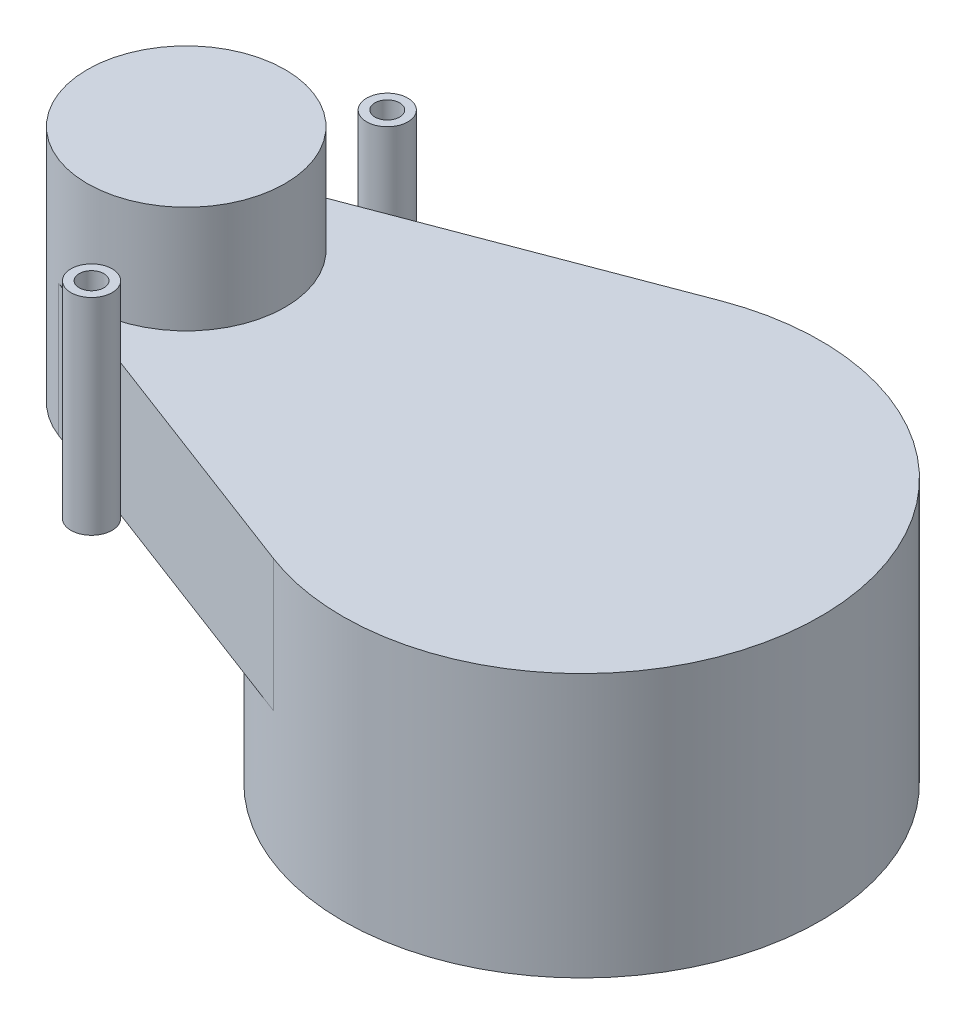
ISO-10303-21;
HEADER;
FILE_DESCRIPTION(('STEP AP214'),'2;1');
FILE_NAME('part.step','',(''),(''),'','','');
FILE_SCHEMA(('AUTOMOTIVE_DESIGN { 1 0 10303 214 1 1 1 1 }'));
ENDSEC;
DATA;
#1=APPLICATION_CONTEXT('core data for automotive mechanical design processes');
#2=APPLICATION_PROTOCOL_DEFINITION('international standard','automotive_design',2000,#1);
#3=PRODUCT_CONTEXT('',#1,'mechanical');
#4=PRODUCT('Part','Part','',(#3));
#5=PRODUCT_RELATED_PRODUCT_CATEGORY('part','',(#4));
#6=PRODUCT_DEFINITION_FORMATION('','',#4);
#7=PRODUCT_DEFINITION_CONTEXT('part definition',#1,'design');
#8=PRODUCT_DEFINITION('design','',#6,#7);
#9=PRODUCT_DEFINITION_SHAPE('','',#8);
#10=(LENGTH_UNIT() NAMED_UNIT(*) SI_UNIT(.MILLI.,.METRE.));
#11=(NAMED_UNIT(*) PLANE_ANGLE_UNIT() SI_UNIT($,.RADIAN.));
#12=(NAMED_UNIT(*) SI_UNIT($,.STERADIAN.) SOLID_ANGLE_UNIT());
#13=UNCERTAINTY_MEASURE_WITH_UNIT(LENGTH_MEASURE(1.E-05),#10,'distance_accuracy_value','');
#14=(GEOMETRIC_REPRESENTATION_CONTEXT(3) GLOBAL_UNCERTAINTY_ASSIGNED_CONTEXT((#13)) GLOBAL_UNIT_ASSIGNED_CONTEXT((#10,
#11,#12)) REPRESENTATION_CONTEXT('',''));
#15=CARTESIAN_POINT('',(0.,0.,0.));
#16=DIRECTION('',(0.,0.,1.));
#17=DIRECTION('',(1.,0.,0.));
#18=AXIS2_PLACEMENT_3D('',#15,#16,#17);
#19=CARTESIAN_POINT('',(-41.5439360482389,25.,-17.95));
#20=DIRECTION('',(0.,1.,0.));
#21=DIRECTION('',(0.,0.,1.));
#22=AXIS2_PLACEMENT_3D('',#19,#20,#21);
#23=PLANE('',#22);
#24=CARTESIAN_POINT('',(-41.5439360482389,25.,-17.95));
#25=DIRECTION('',(0.,1.,0.));
#26=DIRECTION('',(0.,0.,1.));
#27=AXIS2_PLACEMENT_3D('',#24,#25,#26);
#28=CIRCLE('',#27,2.5);
#29=CARTESIAN_POINT('',(-41.5439360482389,25.,-15.45));
#30=VERTEX_POINT('',#29);
#31=EDGE_CURVE('E71',#30,#30,#28,.T.);
#32=ORIENTED_EDGE('',*,*,#31,.T.);
#33=EDGE_LOOP('',(#32));
#34=FACE_BOUND('',#33,.T.);
#35=CARTESIAN_POINT('',(-41.5439360482389,25.,-17.95));
#36=DIRECTION('',(0.,1.,0.));
#37=DIRECTION('',(0.,0.,1.));
#38=AXIS2_PLACEMENT_3D('',#35,#36,#37);
#39=CIRCLE('',#38,1.5);
#40=CARTESIAN_POINT('',(-41.5439360482389,25.,-16.45));
#41=VERTEX_POINT('',#40);
#42=EDGE_CURVE('E62',#41,#41,#39,.T.);
#43=ORIENTED_EDGE('',*,*,#42,.F.);
#44=EDGE_LOOP('',(#43));
#45=FACE_BOUND('',#44,.T.);
#46=ADVANCED_FACE('F58',(#34,#45),#23,.T.);
#47=CARTESIAN_POINT('',(-41.5439360482389,0.,-17.95));
#48=DIRECTION('',(0.,1.,0.));
#49=DIRECTION('',(0.,0.,1.));
#50=AXIS2_PLACEMENT_3D('',#47,#48,#49);
#51=PLANE('',#50);
#52=CARTESIAN_POINT('',(-41.5439360482389,0.,-17.95));
#53=DIRECTION('',(0.,1.,0.));
#54=DIRECTION('',(0.,0.,1.));
#55=AXIS2_PLACEMENT_3D('',#52,#53,#54);
#56=CIRCLE('',#55,2.5);
#57=CARTESIAN_POINT('',(-41.5439360482389,0.,-15.45));
#58=VERTEX_POINT('',#57);
#59=EDGE_CURVE('E69',#58,#58,#56,.T.);
#60=ORIENTED_EDGE('',*,*,#59,.F.);
#61=EDGE_LOOP('',(#60));
#62=FACE_BOUND('',#61,.T.);
#63=CARTESIAN_POINT('',(-41.5439360482389,0.,-17.95));
#64=DIRECTION('',(0.,1.,0.));
#65=DIRECTION('',(0.,0.,1.));
#66=AXIS2_PLACEMENT_3D('',#63,#64,#65);
#67=CIRCLE('',#66,1.5);
#68=CARTESIAN_POINT('',(-41.5439360482389,0.,-16.45));
#69=VERTEX_POINT('',#68);
#70=EDGE_CURVE('E11',#69,#69,#67,.T.);
#71=ORIENTED_EDGE('',*,*,#70,.T.);
#72=EDGE_LOOP('',(#71));
#73=FACE_BOUND('',#72,.T.);
#74=ADVANCED_FACE('F79',(#62,#73),#51,.F.);
#75=CARTESIAN_POINT('',(-41.5439360482389,25.,-17.95));
#76=DIRECTION('',(0.,-1.,0.));
#77=DIRECTION('',(0.,0.,-1.));
#78=AXIS2_PLACEMENT_3D('',#75,#76,#77);
#79=CYLINDRICAL_SURFACE('',#78,2.5);
#80=ORIENTED_EDGE('',*,*,#31,.F.);
#81=EDGE_LOOP('',(#80));
#82=FACE_BOUND('',#81,.T.);
#83=ORIENTED_EDGE('',*,*,#59,.T.);
#84=EDGE_LOOP('',(#83));
#85=FACE_BOUND('',#84,.T.);
#86=ADVANCED_FACE('F77',(#82,#85),#79,.T.);
#87=CARTESIAN_POINT('',(-41.5439360482389,25.,-17.95));
#88=DIRECTION('',(0.,-1.,0.));
#89=DIRECTION('',(0.,0.,-1.));
#90=AXIS2_PLACEMENT_3D('',#87,#88,#89);
#91=CYLINDRICAL_SURFACE('',#90,1.5);
#92=ORIENTED_EDGE('',*,*,#42,.T.);
#93=EDGE_LOOP('',(#92));
#94=FACE_BOUND('',#93,.T.);
#95=ORIENTED_EDGE('',*,*,#70,.F.);
#96=EDGE_LOOP('',(#95));
#97=FACE_BOUND('',#96,.T.);
#98=ADVANCED_FACE('F60',(#94,#97),#91,.F.);
#99=CLOSED_SHELL('',(#46,#74,#86,#98));
#100=MANIFOLD_SOLID_BREP('B2',#99);
#101=CARTESIAN_POINT('',(-41.5439360482389,25.,17.95));
#102=DIRECTION('',(0.,1.,0.));
#103=DIRECTION('',(0.,0.,1.));
#104=AXIS2_PLACEMENT_3D('',#101,#102,#103);
#105=PLANE('',#104);
#106=CARTESIAN_POINT('',(-41.5439360482389,25.,17.95));
#107=DIRECTION('',(0.,1.,0.));
#108=DIRECTION('',(0.,0.,1.));
#109=AXIS2_PLACEMENT_3D('',#106,#107,#108);
#110=CIRCLE('',#109,2.5);
#111=CARTESIAN_POINT('',(-41.5439360482389,25.,20.45));
#112=VERTEX_POINT('',#111);
#113=EDGE_CURVE('E57',#112,#112,#110,.T.);
#114=ORIENTED_EDGE('',*,*,#113,.T.);
#115=EDGE_LOOP('',(#114));
#116=FACE_BOUND('',#115,.T.);
#117=CARTESIAN_POINT('',(-41.5439360482389,25.,17.95));
#118=DIRECTION('',(0.,1.,0.));
#119=DIRECTION('',(0.,0.,1.));
#120=AXIS2_PLACEMENT_3D('',#117,#118,#119);
#121=CIRCLE('',#120,1.5);
#122=CARTESIAN_POINT('',(-41.5439360482389,25.,19.45));
#123=VERTEX_POINT('',#122);
#124=EDGE_CURVE('E156',#123,#123,#121,.T.);
#125=ORIENTED_EDGE('',*,*,#124,.F.);
#126=EDGE_LOOP('',(#125));
#127=FACE_BOUND('',#126,.T.);
#128=ADVANCED_FACE('F145',(#116,#127),#105,.T.);
#129=CARTESIAN_POINT('',(-41.5439360482389,0.,17.95));
#130=DIRECTION('',(0.,1.,0.));
#131=DIRECTION('',(0.,0.,1.));
#132=AXIS2_PLACEMENT_3D('',#129,#130,#131);
#133=PLANE('',#132);
#134=CARTESIAN_POINT('',(-41.5439360482389,0.,17.95));
#135=DIRECTION('',(0.,1.,0.));
#136=DIRECTION('',(0.,0.,1.));
#137=AXIS2_PLACEMENT_3D('',#134,#135,#136);
#138=CIRCLE('',#137,2.5);
#139=CARTESIAN_POINT('',(-41.5439360482389,0.,20.45));
#140=VERTEX_POINT('',#139);
#141=EDGE_CURVE('E149',#140,#140,#138,.T.);
#142=ORIENTED_EDGE('',*,*,#141,.F.);
#143=EDGE_LOOP('',(#142));
#144=FACE_BOUND('',#143,.T.);
#145=CARTESIAN_POINT('',(-41.5439360482389,0.,17.95));
#146=DIRECTION('',(0.,1.,0.));
#147=DIRECTION('',(0.,0.,1.));
#148=AXIS2_PLACEMENT_3D('',#145,#146,#147);
#149=CIRCLE('',#148,1.5);
#150=CARTESIAN_POINT('',(-41.5439360482389,0.,19.45));
#151=VERTEX_POINT('',#150);
#152=EDGE_CURVE('E158',#151,#151,#149,.T.);
#153=ORIENTED_EDGE('',*,*,#152,.T.);
#154=EDGE_LOOP('',(#153));
#155=FACE_BOUND('',#154,.T.);
#156=ADVANCED_FACE('F168',(#144,#155),#133,.F.);
#157=CARTESIAN_POINT('',(-41.5439360482389,25.,17.95));
#158=DIRECTION('',(0.,-1.,0.));
#159=DIRECTION('',(0.,0.,-1.));
#160=AXIS2_PLACEMENT_3D('',#157,#158,#159);
#161=CYLINDRICAL_SURFACE('',#160,2.5);
#162=ORIENTED_EDGE('',*,*,#113,.F.);
#163=EDGE_LOOP('',(#162));
#164=FACE_BOUND('',#163,.T.);
#165=ORIENTED_EDGE('',*,*,#141,.T.);
#166=EDGE_LOOP('',(#165));
#167=FACE_BOUND('',#166,.T.);
#168=ADVANCED_FACE('F147',(#164,#167),#161,.T.);
#169=CARTESIAN_POINT('',(-41.5439360482389,25.,17.95));
#170=DIRECTION('',(0.,-1.,0.));
#171=DIRECTION('',(0.,0.,-1.));
#172=AXIS2_PLACEMENT_3D('',#169,#170,#171);
#173=CYLINDRICAL_SURFACE('',#172,1.5);
#174=ORIENTED_EDGE('',*,*,#124,.T.);
#175=EDGE_LOOP('',(#174));
#176=FACE_BOUND('',#175,.T.);
#177=ORIENTED_EDGE('',*,*,#152,.F.);
#178=EDGE_LOOP('',(#177));
#179=FACE_BOUND('',#178,.T.);
#180=ADVANCED_FACE('F164',(#176,#179),#173,.F.);
#181=CLOSED_SHELL('',(#128,#156,#168,#180));
#182=MANIFOLD_SOLID_BREP('B6',#181);
#183=CARTESIAN_POINT('',(0.,-16.,0.));
#184=DIRECTION('',(0.,1.,0.));
#185=DIRECTION('',(0.,0.,1.));
#186=AXIS2_PLACEMENT_3D('',#183,#184,#185);
#187=CYLINDRICAL_SURFACE('',#186,29.);
#188=CARTESIAN_POINT('',(0.,-16.,0.));
#189=DIRECTION('',(0.,1.,0.));
#190=DIRECTION('',(0.,0.,1.));
#191=AXIS2_PLACEMENT_3D('',#188,#189,#190);
#192=CIRCLE('',#191,29.);
#193=CARTESIAN_POINT('',(0.,-16.,29.));
#194=VERTEX_POINT('',#193);
#195=EDGE_CURVE('E231',#194,#194,#192,.T.);
#196=ORIENTED_EDGE('',*,*,#195,.T.);
#197=EDGE_LOOP('',(#196));
#198=FACE_BOUND('',#197,.T.);
#199=CARTESIAN_POINT('',(0.,0.,0.));
#200=DIRECTION('',(0.,1.,0.));
#201=DIRECTION('',(0.,0.,1.));
#202=AXIS2_PLACEMENT_3D('',#199,#200,#201);
#203=CIRCLE('',#202,29.);
#204=CARTESIAN_POINT('',(-10.2708333333333,0.,-27.1202872890183));
#205=VERTEX_POINT('',#204);
#206=CARTESIAN_POINT('',(-10.2708333333333,0.,27.1202872890183));
#207=VERTEX_POINT('',#206);
#208=EDGE_CURVE('E226',#205,#207,#203,.T.);
#209=ORIENTED_EDGE('',*,*,#208,.F.);
#210=DIRECTION('',(0.,-1.,0.));
#211=VECTOR('',#210,1.);
#212=CARTESIAN_POINT('',(-10.2708333333333,16.,-27.1202872890183));
#213=LINE('',#212,#211);
#214=CARTESIAN_POINT('',(-10.2708333333333,16.,-27.1202872890183));
#215=VERTEX_POINT('',#214);
#216=EDGE_CURVE('E276',#215,#205,#213,.T.);
#217=ORIENTED_EDGE('',*,*,#216,.F.);
#218=CARTESIAN_POINT('',(0.,16.,0.));
#219=DIRECTION('',(0.,1.,0.));
#220=DIRECTION('',(0.,0.,1.));
#221=AXIS2_PLACEMENT_3D('',#218,#219,#220);
#222=CIRCLE('',#221,29.);
#223=CARTESIAN_POINT('',(-10.2708333333333,16.,27.1202872890183));
#224=VERTEX_POINT('',#223);
#225=EDGE_CURVE('E281',#224,#215,#222,.T.);
#226=ORIENTED_EDGE('',*,*,#225,.F.);
#227=DIRECTION('',(0.,-1.,0.));
#228=VECTOR('',#227,1.);
#229=CARTESIAN_POINT('',(-10.2708333333333,16.,27.1202872890183));
#230=LINE('',#229,#228);
#231=EDGE_CURVE('E287',#224,#207,#230,.T.);
#232=ORIENTED_EDGE('',*,*,#231,.T.);
#233=EDGE_LOOP('',(#209,#217,#226,#232));
#234=FACE_BOUND('',#233,.T.);
#235=ADVANCED_FACE('F223',(#198,#234),#187,.T.);
#236=CARTESIAN_POINT('',(0.,-16.,0.));
#237=DIRECTION('',(0.,1.,0.));
#238=DIRECTION('',(0.,0.,1.));
#239=AXIS2_PLACEMENT_3D('',#236,#237,#238);
#240=PLANE('',#239);
#241=ORIENTED_EDGE('',*,*,#195,.F.);
#242=EDGE_LOOP('',(#241));
#243=FACE_BOUND('',#242,.T.);
#244=ADVANCED_FACE('F305',(#243),#240,.F.);
#245=CARTESIAN_POINT('',(0.,0.,0.));
#246=DIRECTION('',(0.,1.,0.));
#247=DIRECTION('',(0.,0.,1.));
#248=AXIS2_PLACEMENT_3D('',#245,#246,#247);
#249=PLANE('',#248);
#250=DIRECTION('',(-0.935182320310977,0.,0.354166666666667));
#251=VECTOR('',#250,1.);
#252=CARTESIAN_POINT('',(-10.2708333333333,0.,-27.1202872890183));
#253=LINE('',#252,#251);
#254=CARTESIAN_POINT('',(-52.25,0.,-11.2221878437317));
#255=VERTEX_POINT('',#254);
#256=EDGE_CURVE('E275',#205,#255,#253,.T.);
#257=ORIENTED_EDGE('',*,*,#256,.F.);
#258=ORIENTED_EDGE('',*,*,#208,.T.);
#259=DIRECTION('',(0.935182320310977,0.,0.354166666666667));
#260=VECTOR('',#259,1.);
#261=CARTESIAN_POINT('',(-10.2708333333333,0.,27.1202872890183));
#262=LINE('',#261,#260);
#263=CARTESIAN_POINT('',(-52.25,0.,11.2221878437317));
#264=VERTEX_POINT('',#263);
#265=EDGE_CURVE('E298',#264,#207,#262,.T.);
#266=ORIENTED_EDGE('',*,*,#265,.F.);
#267=CARTESIAN_POINT('',(-48.,0.,0.));
#268=DIRECTION('',(0.,1.,0.));
#269=DIRECTION('',(0.,0.,1.));
#270=AXIS2_PLACEMENT_3D('',#267,#268,#269);
#271=CIRCLE('',#270,12.);
#272=EDGE_CURVE('E264',#255,#264,#271,.T.);
#273=ORIENTED_EDGE('',*,*,#272,.F.);
#274=EDGE_LOOP('',(#257,#258,#266,#273));
#275=FACE_BOUND('',#274,.T.);
#276=ADVANCED_FACE('F307',(#275),#249,.F.);
#277=CARTESIAN_POINT('',(-10.2708333333333,16.,-27.1202872890183));
#278=DIRECTION('',(0.354166666666667,0.,0.935182320310977));
#279=DIRECTION('',(0.935182320310977,0.,-0.354166666666667));
#280=AXIS2_PLACEMENT_3D('',#277,#278,#279);
#281=PLANE('',#280);
#282=ORIENTED_EDGE('',*,*,#256,.T.);
#283=DIRECTION('',(0.,-1.,0.));
#284=VECTOR('',#283,1.);
#285=CARTESIAN_POINT('',(-52.25,16.,-11.2221878437317));
#286=LINE('',#285,#284);
#287=CARTESIAN_POINT('',(-52.25,16.,-11.2221878437317));
#288=VERTEX_POINT('',#287);
#289=EDGE_CURVE('E273',#288,#255,#286,.T.);
#290=ORIENTED_EDGE('',*,*,#289,.F.);
#291=DIRECTION('',(-0.935182320310977,0.,0.354166666666667));
#292=VECTOR('',#291,1.);
#293=CARTESIAN_POINT('',(-10.2708333333333,16.,-27.1202872890183));
#294=LINE('',#293,#292);
#295=EDGE_CURVE('E271',#215,#288,#294,.T.);
#296=ORIENTED_EDGE('',*,*,#295,.F.);
#297=ORIENTED_EDGE('',*,*,#216,.T.);
#298=EDGE_LOOP('',(#282,#290,#296,#297));
#299=FACE_BOUND('',#298,.T.);
#300=ADVANCED_FACE('F274',(#299),#281,.F.);
#301=CARTESIAN_POINT('',(-48.,16.,0.));
#302=DIRECTION('',(0.,-1.,0.));
#303=DIRECTION('',(0.,0.,-1.));
#304=AXIS2_PLACEMENT_3D('',#301,#302,#303);
#305=CYLINDRICAL_SURFACE('',#304,12.);
#306=ORIENTED_EDGE('',*,*,#272,.T.);
#307=DIRECTION('',(0.,-1.,0.));
#308=VECTOR('',#307,1.);
#309=CARTESIAN_POINT('',(-52.25,16.,11.2221878437317));
#310=LINE('',#309,#308);
#311=CARTESIAN_POINT('',(-52.25,16.,11.2221878437317));
#312=VERTEX_POINT('',#311);
#313=EDGE_CURVE('E277',#312,#264,#310,.T.);
#314=ORIENTED_EDGE('',*,*,#313,.F.);
#315=CARTESIAN_POINT('',(-48.,16.,0.));
#316=DIRECTION('',(0.,1.,0.));
#317=DIRECTION('',(0.,0.,1.));
#318=AXIS2_PLACEMENT_3D('',#315,#316,#317);
#319=CIRCLE('',#318,12.);
#320=EDGE_CURVE('E143',#312,#288,#319,.T.);
#321=ORIENTED_EDGE('',*,*,#320,.T.);
#322=ORIENTED_EDGE('',*,*,#289,.T.);
#323=EDGE_LOOP('',(#306,#314,#321,#322));
#324=FACE_BOUND('',#323,.T.);
#325=CARTESIAN_POINT('',(-48.,29.,0.));
#326=DIRECTION('',(0.,1.,0.));
#327=DIRECTION('',(0.,0.,1.));
#328=AXIS2_PLACEMENT_3D('',#325,#326,#327);
#329=CIRCLE('',#328,12.);
#330=CARTESIAN_POINT('',(-48.,29.,12.));
#331=VERTEX_POINT('',#330);
#332=EDGE_CURVE('E296',#331,#331,#329,.T.);
#333=ORIENTED_EDGE('',*,*,#332,.F.);
#334=EDGE_LOOP('',(#333));
#335=FACE_BOUND('',#334,.T.);
#336=ADVANCED_FACE('F284',(#324,#335),#305,.T.);
#337=CARTESIAN_POINT('',(-10.2708333333333,16.,27.1202872890183));
#338=DIRECTION('',(0.354166666666667,0.,-0.935182320310977));
#339=DIRECTION('',(-0.935182320310977,0.,-0.354166666666667));
#340=AXIS2_PLACEMENT_3D('',#337,#338,#339);
#341=PLANE('',#340);
#342=ORIENTED_EDGE('',*,*,#265,.T.);
#343=ORIENTED_EDGE('',*,*,#231,.F.);
#344=DIRECTION('',(0.935182320310977,0.,0.354166666666667));
#345=VECTOR('',#344,1.);
#346=CARTESIAN_POINT('',(-10.2708333333333,16.,27.1202872890183));
#347=LINE('',#346,#345);
#348=EDGE_CURVE('E247',#312,#224,#347,.T.);
#349=ORIENTED_EDGE('',*,*,#348,.F.);
#350=ORIENTED_EDGE('',*,*,#313,.T.);
#351=EDGE_LOOP('',(#342,#343,#349,#350));
#352=FACE_BOUND('',#351,.T.);
#353=ADVANCED_FACE('F289',(#352),#341,.F.);
#354=CARTESIAN_POINT('',(0.,16.,0.));
#355=DIRECTION('',(0.,1.,0.));
#356=DIRECTION('',(0.,0.,1.));
#357=AXIS2_PLACEMENT_3D('',#354,#355,#356);
#358=PLANE('',#357);
#359=ORIENTED_EDGE('',*,*,#320,.F.);
#360=ORIENTED_EDGE('',*,*,#348,.T.);
#361=ORIENTED_EDGE('',*,*,#225,.T.);
#362=ORIENTED_EDGE('',*,*,#295,.T.);
#363=EDGE_LOOP('',(#359,#360,#361,#362));
#364=FACE_BOUND('',#363,.T.);
#365=ADVANCED_FACE('F279',(#364),#358,.T.);
#366=CARTESIAN_POINT('',(0.,29.,0.));
#367=DIRECTION('',(0.,1.,0.));
#368=DIRECTION('',(0.,0.,1.));
#369=AXIS2_PLACEMENT_3D('',#366,#367,#368);
#370=PLANE('',#369);
#371=ORIENTED_EDGE('',*,*,#332,.T.);
#372=EDGE_LOOP('',(#371));
#373=FACE_BOUND('',#372,.T.);
#374=ADVANCED_FACE('F322',(#373),#370,.T.);
#375=CLOSED_SHELL('',(#235,#244,#276,#300,#336,#353,#365,#374));
#376=MANIFOLD_SOLID_BREP('B52',#375);
#377=ADVANCED_BREP_SHAPE_REPRESENTATION('',(#18,#100,#182,#376),#14);
#378=SHAPE_DEFINITION_REPRESENTATION(#9,#377);
ENDSEC;
END-ISO-10303-21;
